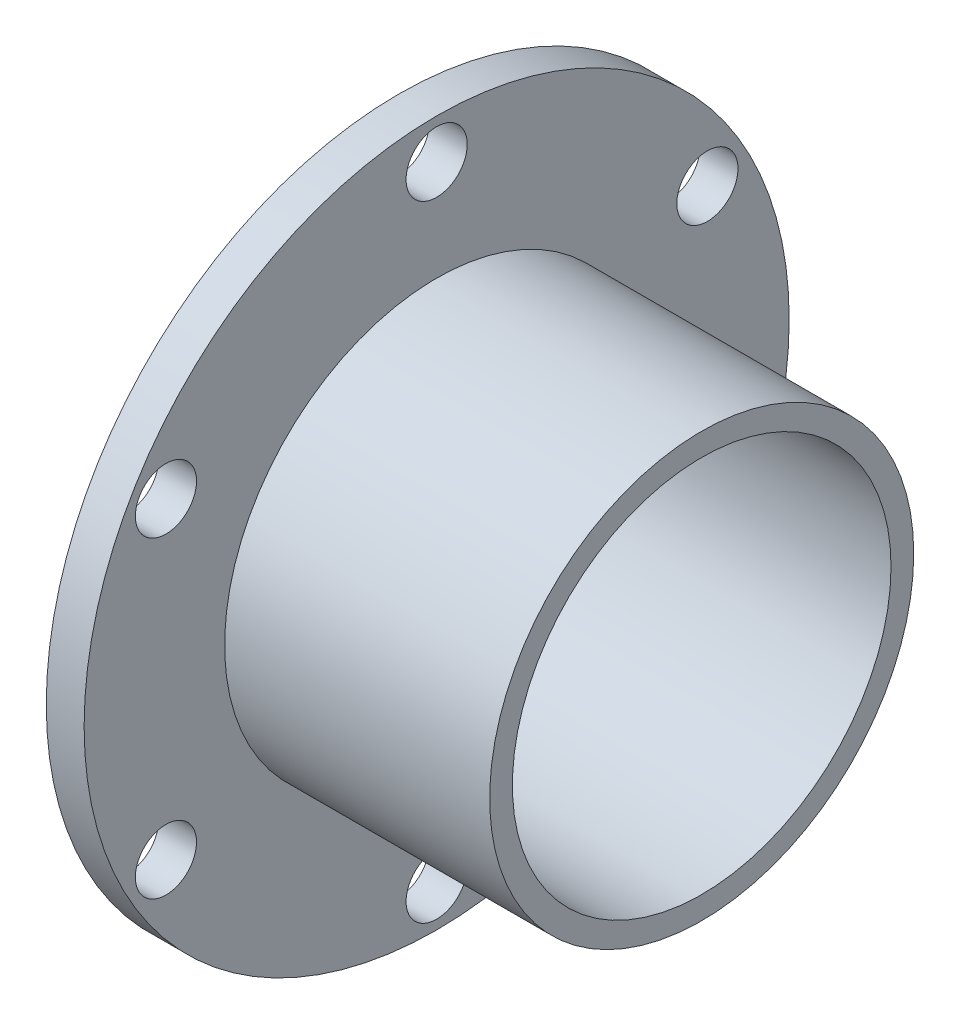
ISO-10303-21;
HEADER;
FILE_DESCRIPTION(('STEP AP214'),'2;1');
FILE_NAME('part.step','',(''),(''),'','','');
FILE_SCHEMA(('AUTOMOTIVE_DESIGN { 1 0 10303 214 1 1 1 1 }'));
ENDSEC;
DATA;
#1=APPLICATION_CONTEXT('core data for automotive mechanical design processes');
#2=APPLICATION_PROTOCOL_DEFINITION('international standard','automotive_design',2000,#1);
#3=PRODUCT_CONTEXT('',#1,'mechanical');
#4=PRODUCT('Part','Part','',(#3));
#5=PRODUCT_RELATED_PRODUCT_CATEGORY('part','',(#4));
#6=PRODUCT_DEFINITION_FORMATION('','',#4);
#7=PRODUCT_DEFINITION_CONTEXT('part definition',#1,'design');
#8=PRODUCT_DEFINITION('design','',#6,#7);
#9=PRODUCT_DEFINITION_SHAPE('','',#8);
#10=(LENGTH_UNIT() NAMED_UNIT(*) SI_UNIT(.MILLI.,.METRE.));
#11=(NAMED_UNIT(*) PLANE_ANGLE_UNIT() SI_UNIT($,.RADIAN.));
#12=(NAMED_UNIT(*) SI_UNIT($,.STERADIAN.) SOLID_ANGLE_UNIT());
#13=UNCERTAINTY_MEASURE_WITH_UNIT(LENGTH_MEASURE(1.E-05),#10,'distance_accuracy_value','');
#14=(GEOMETRIC_REPRESENTATION_CONTEXT(3) GLOBAL_UNCERTAINTY_ASSIGNED_CONTEXT((#13)) GLOBAL_UNIT_ASSIGNED_CONTEXT((#10,
#11,#12)) REPRESENTATION_CONTEXT('',''));
#15=CARTESIAN_POINT('',(0.,0.,0.));
#16=DIRECTION('',(0.,0.,1.));
#17=DIRECTION('',(1.,0.,0.));
#18=AXIS2_PLACEMENT_3D('',#15,#16,#17);
#19=CARTESIAN_POINT('',(2.5,0.,0.));
#20=DIRECTION('',(1.,0.,0.));
#21=DIRECTION('',(0.,0.,-1.));
#22=AXIS2_PLACEMENT_3D('',#19,#20,#21);
#23=PLANE('',#22);
#24=CARTESIAN_POINT('',(2.5,0.,0.));
#25=DIRECTION('',(1.,0.,0.));
#26=DIRECTION('',(0.,0.,-1.));
#27=AXIS2_PLACEMENT_3D('',#24,#25,#26);
#28=CIRCLE('',#27,14.);
#29=CARTESIAN_POINT('',(2.5,0.,-14.));
#30=VERTEX_POINT('',#29);
#31=EDGE_CURVE('E102',#30,#30,#28,.T.);
#32=ORIENTED_EDGE('',*,*,#31,.F.);
#33=EDGE_LOOP('',(#32));
#34=FACE_BOUND('',#33,.T.);
#35=CARTESIAN_POINT('',(2.5,-10.3199999999998,17.8747643341109));
#36=DIRECTION('',(1.,0.,0.));
#37=DIRECTION('',(0.,0.,-1.));
#38=AXIS2_PLACEMENT_3D('',#35,#36,#37);
#39=CIRCLE('',#38,2.01929999999999);
#40=CARTESIAN_POINT('',(2.5,-10.3199999999998,15.8554643341109));
#41=VERTEX_POINT('',#40);
#42=EDGE_CURVE('E86',#41,#41,#39,.T.);
#43=ORIENTED_EDGE('',*,*,#42,.F.);
#44=EDGE_LOOP('',(#43));
#45=FACE_BOUND('',#44,.T.);
#46=CARTESIAN_POINT('',(2.5,-10.3200000000001,-17.8747643341108));
#47=DIRECTION('',(1.,0.,0.));
#48=DIRECTION('',(0.,0.,-1.));
#49=AXIS2_PLACEMENT_3D('',#46,#47,#48);
#50=CIRCLE('',#49,2.01929999999999);
#51=CARTESIAN_POINT('',(2.5,-10.3200000000001,-19.8940643341108));
#52=VERTEX_POINT('',#51);
#53=EDGE_CURVE('E70',#52,#52,#50,.T.);
#54=ORIENTED_EDGE('',*,*,#53,.F.);
#55=EDGE_LOOP('',(#54));
#56=FACE_BOUND('',#55,.T.);
#57=CARTESIAN_POINT('',(2.5,20.64,0.));
#58=DIRECTION('',(1.,0.,0.));
#59=DIRECTION('',(0.,0.,-1.));
#60=AXIS2_PLACEMENT_3D('',#57,#58,#59);
#61=CIRCLE('',#60,2.01929999999999);
#62=CARTESIAN_POINT('',(2.5,20.64,-2.01929999999999));
#63=VERTEX_POINT('',#62);
#64=EDGE_CURVE('E56',#63,#63,#61,.T.);
#65=ORIENTED_EDGE('',*,*,#64,.F.);
#66=EDGE_LOOP('',(#65));
#67=FACE_BOUND('',#66,.T.);
#68=CARTESIAN_POINT('',(2.5,0.,0.));
#69=DIRECTION('',(1.,0.,0.));
#70=DIRECTION('',(0.,0.,-1.));
#71=AXIS2_PLACEMENT_3D('',#68,#69,#70);
#72=CIRCLE('',#71,23.2760744987721);
#73=CARTESIAN_POINT('',(2.5,0.,-23.2760744987721));
#74=VERTEX_POINT('',#73);
#75=EDGE_CURVE('E10',#74,#74,#72,.T.);
#76=ORIENTED_EDGE('',*,*,#75,.T.);
#77=EDGE_LOOP('',(#76));
#78=FACE_BOUND('',#77,.T.);
#79=CARTESIAN_POINT('',(2.5,10.32,-17.8747643341108));
#80=DIRECTION('',(1.,0.,0.));
#81=DIRECTION('',(0.,0.,-1.));
#82=AXIS2_PLACEMENT_3D('',#79,#80,#81);
#83=CIRCLE('',#82,2.01929999999999);
#84=CARTESIAN_POINT('',(2.5,10.32,-19.8940643341108));
#85=VERTEX_POINT('',#84);
#86=EDGE_CURVE('E62',#85,#85,#83,.T.);
#87=ORIENTED_EDGE('',*,*,#86,.F.);
#88=EDGE_LOOP('',(#87));
#89=FACE_BOUND('',#88,.T.);
#90=CARTESIAN_POINT('',(2.5,-20.64,1.44128349667445E-13));
#91=DIRECTION('',(1.,0.,0.));
#92=DIRECTION('',(0.,0.,-1.));
#93=AXIS2_PLACEMENT_3D('',#90,#91,#92);
#94=CIRCLE('',#93,2.01929999999999);
#95=CARTESIAN_POINT('',(2.5,-20.64,-2.01929999999985));
#96=VERTEX_POINT('',#95);
#97=EDGE_CURVE('E78',#96,#96,#94,.T.);
#98=ORIENTED_EDGE('',*,*,#97,.F.);
#99=EDGE_LOOP('',(#98));
#100=FACE_BOUND('',#99,.T.);
#101=CARTESIAN_POINT('',(2.5,10.3200000000002,17.8747643341107));
#102=DIRECTION('',(1.,0.,0.));
#103=DIRECTION('',(0.,0.,-1.));
#104=AXIS2_PLACEMENT_3D('',#101,#102,#103);
#105=CIRCLE('',#104,2.01929999999999);
#106=CARTESIAN_POINT('',(2.5,10.3200000000002,15.8554643341107));
#107=VERTEX_POINT('',#106);
#108=EDGE_CURVE('E94',#107,#107,#105,.T.);
#109=ORIENTED_EDGE('',*,*,#108,.F.);
#110=EDGE_LOOP('',(#109));
#111=FACE_BOUND('',#110,.T.);
#112=ADVANCED_FACE('F43',(#34,#45,#56,#67,#78,#89,#100,#111),#23,.T.);
#113=CARTESIAN_POINT('',(0.,0.,0.));
#114=DIRECTION('',(1.,0.,0.));
#115=DIRECTION('',(0.,0.,-1.));
#116=AXIS2_PLACEMENT_3D('',#113,#114,#115);
#117=PLANE('',#116);
#118=CARTESIAN_POINT('',(0.,0.,0.));
#119=DIRECTION('',(1.,0.,0.));
#120=DIRECTION('',(0.,0.,-1.));
#121=AXIS2_PLACEMENT_3D('',#118,#119,#120);
#122=CIRCLE('',#121,23.2760744987721);
#123=CARTESIAN_POINT('',(0.,0.,-23.2760744987721));
#124=VERTEX_POINT('',#123);
#125=EDGE_CURVE('E47',#124,#124,#122,.T.);
#126=ORIENTED_EDGE('',*,*,#125,.F.);
#127=EDGE_LOOP('',(#126));
#128=FACE_BOUND('',#127,.T.);
#129=CARTESIAN_POINT('',(0.,20.64,0.));
#130=DIRECTION('',(1.,0.,0.));
#131=DIRECTION('',(0.,0.,-1.));
#132=AXIS2_PLACEMENT_3D('',#129,#130,#131);
#133=CIRCLE('',#132,2.01929999999999);
#134=CARTESIAN_POINT('',(0.,20.64,-2.01929999999999));
#135=VERTEX_POINT('',#134);
#136=EDGE_CURVE('E58',#135,#135,#133,.T.);
#137=ORIENTED_EDGE('',*,*,#136,.T.);
#138=EDGE_LOOP('',(#137));
#139=FACE_BOUND('',#138,.T.);
#140=CARTESIAN_POINT('',(0.,10.32,-17.8747643341108));
#141=DIRECTION('',(1.,0.,0.));
#142=DIRECTION('',(0.,0.,-1.));
#143=AXIS2_PLACEMENT_3D('',#140,#141,#142);
#144=CIRCLE('',#143,2.01929999999999);
#145=CARTESIAN_POINT('',(0.,10.32,-19.8940643341108));
#146=VERTEX_POINT('',#145);
#147=EDGE_CURVE('E66',#146,#146,#144,.T.);
#148=ORIENTED_EDGE('',*,*,#147,.T.);
#149=EDGE_LOOP('',(#148));
#150=FACE_BOUND('',#149,.T.);
#151=CARTESIAN_POINT('',(0.,-10.3200000000001,-17.8747643341108));
#152=DIRECTION('',(1.,0.,0.));
#153=DIRECTION('',(0.,0.,-1.));
#154=AXIS2_PLACEMENT_3D('',#151,#152,#153);
#155=CIRCLE('',#154,2.01929999999999);
#156=CARTESIAN_POINT('',(0.,-10.3200000000001,-19.8940643341108));
#157=VERTEX_POINT('',#156);
#158=EDGE_CURVE('E74',#157,#157,#155,.T.);
#159=ORIENTED_EDGE('',*,*,#158,.T.);
#160=EDGE_LOOP('',(#159));
#161=FACE_BOUND('',#160,.T.);
#162=CARTESIAN_POINT('',(0.,-20.64,1.44128349667445E-13));
#163=DIRECTION('',(1.,0.,0.));
#164=DIRECTION('',(0.,0.,-1.));
#165=AXIS2_PLACEMENT_3D('',#162,#163,#164);
#166=CIRCLE('',#165,2.01929999999999);
#167=CARTESIAN_POINT('',(0.,-20.64,-2.01929999999985));
#168=VERTEX_POINT('',#167);
#169=EDGE_CURVE('E82',#168,#168,#166,.T.);
#170=ORIENTED_EDGE('',*,*,#169,.T.);
#171=EDGE_LOOP('',(#170));
#172=FACE_BOUND('',#171,.T.);
#173=CARTESIAN_POINT('',(0.,-10.3199999999998,17.8747643341109));
#174=DIRECTION('',(1.,0.,0.));
#175=DIRECTION('',(0.,0.,-1.));
#176=AXIS2_PLACEMENT_3D('',#173,#174,#175);
#177=CIRCLE('',#176,2.01929999999999);
#178=CARTESIAN_POINT('',(0.,-10.3199999999998,15.8554643341109));
#179=VERTEX_POINT('',#178);
#180=EDGE_CURVE('E90',#179,#179,#177,.T.);
#181=ORIENTED_EDGE('',*,*,#180,.T.);
#182=EDGE_LOOP('',(#181));
#183=FACE_BOUND('',#182,.T.);
#184=CARTESIAN_POINT('',(0.,10.3200000000002,17.8747643341107));
#185=DIRECTION('',(1.,0.,0.));
#186=DIRECTION('',(0.,0.,-1.));
#187=AXIS2_PLACEMENT_3D('',#184,#185,#186);
#188=CIRCLE('',#187,2.01929999999999);
#189=CARTESIAN_POINT('',(0.,10.3200000000002,15.8554643341107));
#190=VERTEX_POINT('',#189);
#191=EDGE_CURVE('E98',#190,#190,#188,.T.);
#192=ORIENTED_EDGE('',*,*,#191,.T.);
#193=EDGE_LOOP('',(#192));
#194=FACE_BOUND('',#193,.T.);
#195=CARTESIAN_POINT('',(0.,0.,0.));
#196=DIRECTION('',(1.,0.,0.));
#197=DIRECTION('',(0.,0.,-1.));
#198=AXIS2_PLACEMENT_3D('',#195,#196,#197);
#199=CIRCLE('',#198,12.5);
#200=CARTESIAN_POINT('',(0.,0.,-12.5));
#201=VERTEX_POINT('',#200);
#202=EDGE_CURVE('E114',#201,#201,#199,.T.);
#203=ORIENTED_EDGE('',*,*,#202,.T.);
#204=EDGE_LOOP('',(#203));
#205=FACE_BOUND('',#204,.T.);
#206=ADVANCED_FACE('F143',(#128,#139,#150,#161,#172,#183,#194,#205),#117,.F.);
#207=CARTESIAN_POINT('',(2.5,0.,0.));
#208=DIRECTION('',(-1.,0.,0.));
#209=DIRECTION('',(0.,0.,1.));
#210=AXIS2_PLACEMENT_3D('',#207,#208,#209);
#211=CYLINDRICAL_SURFACE('',#210,23.2760744987721);
#212=ORIENTED_EDGE('',*,*,#75,.F.);
#213=EDGE_LOOP('',(#212));
#214=FACE_BOUND('',#213,.T.);
#215=ORIENTED_EDGE('',*,*,#125,.T.);
#216=EDGE_LOOP('',(#215));
#217=FACE_BOUND('',#216,.T.);
#218=ADVANCED_FACE('F45',(#214,#217),#211,.T.);
#219=CARTESIAN_POINT('',(2.5,20.64,0.));
#220=DIRECTION('',(-1.,0.,0.));
#221=DIRECTION('',(0.,0.,1.));
#222=AXIS2_PLACEMENT_3D('',#219,#220,#221);
#223=CYLINDRICAL_SURFACE('',#222,2.01929999999999);
#224=ORIENTED_EDGE('',*,*,#64,.T.);
#225=EDGE_LOOP('',(#224));
#226=FACE_BOUND('',#225,.T.);
#227=ORIENTED_EDGE('',*,*,#136,.F.);
#228=EDGE_LOOP('',(#227));
#229=FACE_BOUND('',#228,.T.);
#230=ADVANCED_FACE('F152',(#226,#229),#223,.F.);
#231=CARTESIAN_POINT('',(2.5,10.32,-17.8747643341108));
#232=DIRECTION('',(-1.,0.,0.));
#233=DIRECTION('',(0.,0.,1.));
#234=AXIS2_PLACEMENT_3D('',#231,#232,#233);
#235=CYLINDRICAL_SURFACE('',#234,2.01929999999999);
#236=ORIENTED_EDGE('',*,*,#86,.T.);
#237=EDGE_LOOP('',(#236));
#238=FACE_BOUND('',#237,.T.);
#239=ORIENTED_EDGE('',*,*,#147,.F.);
#240=EDGE_LOOP('',(#239));
#241=FACE_BOUND('',#240,.T.);
#242=ADVANCED_FACE('F155',(#238,#241),#235,.F.);
#243=CARTESIAN_POINT('',(2.5,-10.3200000000001,-17.8747643341108));
#244=DIRECTION('',(-1.,0.,0.));
#245=DIRECTION('',(0.,0.,1.));
#246=AXIS2_PLACEMENT_3D('',#243,#244,#245);
#247=CYLINDRICAL_SURFACE('',#246,2.01929999999999);
#248=ORIENTED_EDGE('',*,*,#53,.T.);
#249=EDGE_LOOP('',(#248));
#250=FACE_BOUND('',#249,.T.);
#251=ORIENTED_EDGE('',*,*,#158,.F.);
#252=EDGE_LOOP('',(#251));
#253=FACE_BOUND('',#252,.T.);
#254=ADVANCED_FACE('F159',(#250,#253),#247,.F.);
#255=CARTESIAN_POINT('',(2.5,-20.64,1.44128349667445E-13));
#256=DIRECTION('',(-1.,0.,0.));
#257=DIRECTION('',(0.,0.,1.));
#258=AXIS2_PLACEMENT_3D('',#255,#256,#257);
#259=CYLINDRICAL_SURFACE('',#258,2.01929999999999);
#260=ORIENTED_EDGE('',*,*,#97,.T.);
#261=EDGE_LOOP('',(#260));
#262=FACE_BOUND('',#261,.T.);
#263=ORIENTED_EDGE('',*,*,#169,.F.);
#264=EDGE_LOOP('',(#263));
#265=FACE_BOUND('',#264,.T.);
#266=ADVANCED_FACE('F163',(#262,#265),#259,.F.);
#267=CARTESIAN_POINT('',(2.5,-10.3199999999998,17.8747643341109));
#268=DIRECTION('',(-1.,0.,0.));
#269=DIRECTION('',(0.,0.,1.));
#270=AXIS2_PLACEMENT_3D('',#267,#268,#269);
#271=CYLINDRICAL_SURFACE('',#270,2.01929999999999);
#272=ORIENTED_EDGE('',*,*,#42,.T.);
#273=EDGE_LOOP('',(#272));
#274=FACE_BOUND('',#273,.T.);
#275=ORIENTED_EDGE('',*,*,#180,.F.);
#276=EDGE_LOOP('',(#275));
#277=FACE_BOUND('',#276,.T.);
#278=ADVANCED_FACE('F138',(#274,#277),#271,.F.);
#279=CARTESIAN_POINT('',(2.5,10.3200000000002,17.8747643341107));
#280=DIRECTION('',(-1.,0.,0.));
#281=DIRECTION('',(0.,0.,1.));
#282=AXIS2_PLACEMENT_3D('',#279,#280,#281);
#283=CYLINDRICAL_SURFACE('',#282,2.01929999999999);
#284=ORIENTED_EDGE('',*,*,#108,.T.);
#285=EDGE_LOOP('',(#284));
#286=FACE_BOUND('',#285,.T.);
#287=ORIENTED_EDGE('',*,*,#191,.F.);
#288=EDGE_LOOP('',(#287));
#289=FACE_BOUND('',#288,.T.);
#290=ADVANCED_FACE('F128',(#286,#289),#283,.F.);
#291=CARTESIAN_POINT('',(20.,0.,0.));
#292=DIRECTION('',(1.,0.,0.));
#293=DIRECTION('',(0.,0.,-1.));
#294=AXIS2_PLACEMENT_3D('',#291,#292,#293);
#295=PLANE('',#294);
#296=CARTESIAN_POINT('',(20.,0.,0.));
#297=DIRECTION('',(1.,0.,0.));
#298=DIRECTION('',(0.,0.,-1.));
#299=AXIS2_PLACEMENT_3D('',#296,#297,#298);
#300=CIRCLE('',#299,14.);
#301=CARTESIAN_POINT('',(20.,0.,-14.));
#302=VERTEX_POINT('',#301);
#303=EDGE_CURVE('E109',#302,#302,#300,.T.);
#304=ORIENTED_EDGE('',*,*,#303,.T.);
#305=EDGE_LOOP('',(#304));
#306=FACE_BOUND('',#305,.T.);
#307=CARTESIAN_POINT('',(20.,0.,0.));
#308=DIRECTION('',(1.,0.,0.));
#309=DIRECTION('',(0.,0.,-1.));
#310=AXIS2_PLACEMENT_3D('',#307,#308,#309);
#311=CIRCLE('',#310,12.5);
#312=CARTESIAN_POINT('',(20.,0.,-12.5));
#313=VERTEX_POINT('',#312);
#314=EDGE_CURVE('E113',#313,#313,#311,.T.);
#315=ORIENTED_EDGE('',*,*,#314,.F.);
#316=EDGE_LOOP('',(#315));
#317=FACE_BOUND('',#316,.T.);
#318=ADVANCED_FACE('F125',(#306,#317),#295,.T.);
#319=CARTESIAN_POINT('',(20.,0.,0.));
#320=DIRECTION('',(-1.,0.,0.));
#321=DIRECTION('',(0.,0.,1.));
#322=AXIS2_PLACEMENT_3D('',#319,#320,#321);
#323=CYLINDRICAL_SURFACE('',#322,14.);
#324=ORIENTED_EDGE('',*,*,#31,.T.);
#325=EDGE_LOOP('',(#324));
#326=FACE_BOUND('',#325,.T.);
#327=ORIENTED_EDGE('',*,*,#303,.F.);
#328=EDGE_LOOP('',(#327));
#329=FACE_BOUND('',#328,.T.);
#330=ADVANCED_FACE('F127',(#326,#329),#323,.T.);
#331=CARTESIAN_POINT('',(20.,0.,0.));
#332=DIRECTION('',(-1.,0.,0.));
#333=DIRECTION('',(0.,0.,1.));
#334=AXIS2_PLACEMENT_3D('',#331,#332,#333);
#335=CYLINDRICAL_SURFACE('',#334,12.5);
#336=ORIENTED_EDGE('',*,*,#314,.T.);
#337=EDGE_LOOP('',(#336));
#338=FACE_BOUND('',#337,.T.);
#339=ORIENTED_EDGE('',*,*,#202,.F.);
#340=EDGE_LOOP('',(#339));
#341=FACE_BOUND('',#340,.T.);
#342=ADVANCED_FACE('F122',(#338,#341),#335,.F.);
#343=CLOSED_SHELL('',(#112,#206,#218,#230,#242,#254,#266,#278,#290,#318,#330,#342));
#344=MANIFOLD_SOLID_BREP('B2',#343);
#345=ADVANCED_BREP_SHAPE_REPRESENTATION('',(#18,#344),#14);
#346=SHAPE_DEFINITION_REPRESENTATION(#9,#345);
ENDSEC;
END-ISO-10303-21;
